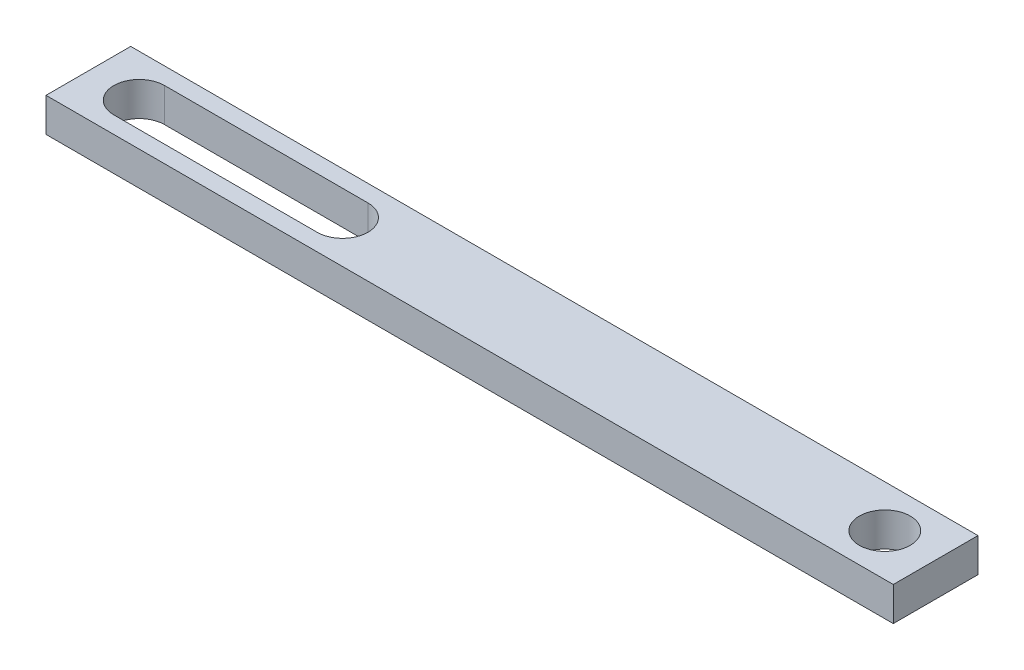
ISO-10303-21;
HEADER;
FILE_DESCRIPTION(('STEP AP214'),'2;1');
FILE_NAME('part.step','',(''),(''),'','','');
FILE_SCHEMA(('AUTOMOTIVE_DESIGN { 1 0 10303 214 1 1 1 1 }'));
ENDSEC;
DATA;
#1=APPLICATION_CONTEXT('core data for automotive mechanical design processes');
#2=APPLICATION_PROTOCOL_DEFINITION('international standard','automotive_design',2000,#1);
#3=PRODUCT_CONTEXT('',#1,'mechanical');
#4=PRODUCT('Part','Part','',(#3));
#5=PRODUCT_RELATED_PRODUCT_CATEGORY('part','',(#4));
#6=PRODUCT_DEFINITION_FORMATION('','',#4);
#7=PRODUCT_DEFINITION_CONTEXT('part definition',#1,'design');
#8=PRODUCT_DEFINITION('design','',#6,#7);
#9=PRODUCT_DEFINITION_SHAPE('','',#8);
#10=(LENGTH_UNIT() NAMED_UNIT(*) SI_UNIT(.MILLI.,.METRE.));
#11=(NAMED_UNIT(*) PLANE_ANGLE_UNIT() SI_UNIT($,.RADIAN.));
#12=(NAMED_UNIT(*) SI_UNIT($,.STERADIAN.) SOLID_ANGLE_UNIT());
#13=UNCERTAINTY_MEASURE_WITH_UNIT(LENGTH_MEASURE(1.E-05),#10,'distance_accuracy_value','');
#14=(GEOMETRIC_REPRESENTATION_CONTEXT(3) GLOBAL_UNCERTAINTY_ASSIGNED_CONTEXT((#13)) GLOBAL_UNIT_ASSIGNED_CONTEXT((#10,
#11,#12)) REPRESENTATION_CONTEXT('',''));
#15=CARTESIAN_POINT('',(0.,0.,0.));
#16=DIRECTION('',(0.,0.,1.));
#17=DIRECTION('',(1.,0.,0.));
#18=AXIS2_PLACEMENT_3D('',#15,#16,#17);
#19=CARTESIAN_POINT('',(0.,2.,0.));
#20=DIRECTION('',(0.,-1.,0.));
#21=DIRECTION('',(0.,0.,-1.));
#22=AXIS2_PLACEMENT_3D('',#19,#20,#21);
#23=PLANE('',#22);
#24=CARTESIAN_POINT('',(47.,2.,-2.5));
#25=DIRECTION('',(0.,1.,0.));
#26=DIRECTION('',(0.,0.,1.));
#27=AXIS2_PLACEMENT_3D('',#24,#25,#26);
#28=CIRCLE('',#27,1.5);
#29=CARTESIAN_POINT('',(47.,2.,-0.999999999999996));
#30=VERTEX_POINT('',#29);
#31=EDGE_CURVE('E141',#30,#30,#28,.T.);
#32=ORIENTED_EDGE('',*,*,#31,.F.);
#33=EDGE_LOOP('',(#32));
#34=FACE_BOUND('',#33,.T.);
#35=DIRECTION('',(0.,0.,1.));
#36=VECTOR('',#35,1.);
#37=CARTESIAN_POINT('',(0.,2.,0.));
#38=LINE('',#37,#36);
#39=CARTESIAN_POINT('',(0.,2.,-5.));
#40=VERTEX_POINT('',#39);
#41=CARTESIAN_POINT('',(0.,2.,0.));
#42=VERTEX_POINT('',#41);
#43=EDGE_CURVE('E147',#40,#42,#38,.T.);
#44=ORIENTED_EDGE('',*,*,#43,.T.);
#45=DIRECTION('',(1.,0.,0.));
#46=VECTOR('',#45,1.);
#47=CARTESIAN_POINT('',(0.,2.,0.));
#48=LINE('',#47,#46);
#49=CARTESIAN_POINT('',(50.,2.,0.));
#50=VERTEX_POINT('',#49);
#51=EDGE_CURVE('E150',#42,#50,#48,.T.);
#52=ORIENTED_EDGE('',*,*,#51,.T.);
#53=DIRECTION('',(0.,0.,-1.));
#54=VECTOR('',#53,1.);
#55=CARTESIAN_POINT('',(50.,2.,0.));
#56=LINE('',#55,#54);
#57=CARTESIAN_POINT('',(50.,2.,-5.));
#58=VERTEX_POINT('',#57);
#59=EDGE_CURVE('E153',#50,#58,#56,.T.);
#60=ORIENTED_EDGE('',*,*,#59,.T.);
#61=DIRECTION('',(-1.,0.,0.));
#62=VECTOR('',#61,1.);
#63=CARTESIAN_POINT('',(0.,2.,-5.));
#64=LINE('',#63,#62);
#65=EDGE_CURVE('E155',#58,#40,#64,.T.);
#66=ORIENTED_EDGE('',*,*,#65,.T.);
#67=EDGE_LOOP('',(#44,#52,#60,#66));
#68=FACE_BOUND('',#67,.T.);
#69=CARTESIAN_POINT('',(15.,2.,-2.5));
#70=DIRECTION('',(0.,1.,0.));
#71=DIRECTION('',(0.,0.,1.));
#72=AXIS2_PLACEMENT_3D('',#69,#70,#71);
#73=CIRCLE('',#72,1.5);
#74=CARTESIAN_POINT('',(15.,2.,-0.999999999999999));
#75=VERTEX_POINT('',#74);
#76=CARTESIAN_POINT('',(15.,2.,-4.));
#77=VERTEX_POINT('',#76);
#78=EDGE_CURVE('E105',#75,#77,#73,.T.);
#79=ORIENTED_EDGE('',*,*,#78,.F.);
#80=DIRECTION('',(1.,0.,0.));
#81=VECTOR('',#80,1.);
#82=CARTESIAN_POINT('',(15.,2.,-0.999999999999999));
#83=LINE('',#82,#81);
#84=CARTESIAN_POINT('',(3.,2.,-0.999999999999999));
#85=VERTEX_POINT('',#84);
#86=EDGE_CURVE('E127',#85,#75,#83,.T.);
#87=ORIENTED_EDGE('',*,*,#86,.F.);
#88=CARTESIAN_POINT('',(3.,2.,-2.5));
#89=DIRECTION('',(0.,1.,0.));
#90=DIRECTION('',(0.,0.,1.));
#91=AXIS2_PLACEMENT_3D('',#88,#89,#90);
#92=CIRCLE('',#91,1.5);
#93=CARTESIAN_POINT('',(3.,2.,-4.));
#94=VERTEX_POINT('',#93);
#95=EDGE_CURVE('E125',#94,#85,#92,.T.);
#96=ORIENTED_EDGE('',*,*,#95,.F.);
#97=DIRECTION('',(-1.,0.,0.));
#98=VECTOR('',#97,1.);
#99=CARTESIAN_POINT('',(3.,2.,-4.));
#100=LINE('',#99,#98);
#101=EDGE_CURVE('E113',#77,#94,#100,.T.);
#102=ORIENTED_EDGE('',*,*,#101,.F.);
#103=EDGE_LOOP('',(#79,#87,#96,#102));
#104=FACE_BOUND('',#103,.T.);
#105=ADVANCED_FACE('F40',(#34,#68,#104),#23,.F.);
#106=CARTESIAN_POINT('',(0.,0.,0.));
#107=DIRECTION('',(0.,-1.,0.));
#108=DIRECTION('',(0.,0.,-1.));
#109=AXIS2_PLACEMENT_3D('',#106,#107,#108);
#110=PLANE('',#109);
#111=DIRECTION('',(0.,0.,1.));
#112=VECTOR('',#111,1.);
#113=CARTESIAN_POINT('',(0.,0.,0.));
#114=LINE('',#113,#112);
#115=CARTESIAN_POINT('',(0.,0.,-5.));
#116=VERTEX_POINT('',#115);
#117=CARTESIAN_POINT('',(0.,0.,0.));
#118=VERTEX_POINT('',#117);
#119=EDGE_CURVE('E144',#116,#118,#114,.T.);
#120=ORIENTED_EDGE('',*,*,#119,.F.);
#121=DIRECTION('',(-1.,0.,0.));
#122=VECTOR('',#121,1.);
#123=CARTESIAN_POINT('',(0.,0.,-5.));
#124=LINE('',#123,#122);
#125=CARTESIAN_POINT('',(50.,0.,-5.));
#126=VERTEX_POINT('',#125);
#127=EDGE_CURVE('E151',#126,#116,#124,.T.);
#128=ORIENTED_EDGE('',*,*,#127,.F.);
#129=DIRECTION('',(0.,0.,-1.));
#130=VECTOR('',#129,1.);
#131=CARTESIAN_POINT('',(50.,0.,0.));
#132=LINE('',#131,#130);
#133=CARTESIAN_POINT('',(50.,0.,0.));
#134=VERTEX_POINT('',#133);
#135=EDGE_CURVE('E162',#134,#126,#132,.T.);
#136=ORIENTED_EDGE('',*,*,#135,.F.);
#137=DIRECTION('',(1.,0.,0.));
#138=VECTOR('',#137,1.);
#139=CARTESIAN_POINT('',(0.,0.,0.));
#140=LINE('',#139,#138);
#141=EDGE_CURVE('E160',#118,#134,#140,.T.);
#142=ORIENTED_EDGE('',*,*,#141,.F.);
#143=EDGE_LOOP('',(#120,#128,#136,#142));
#144=FACE_BOUND('',#143,.T.);
#145=CARTESIAN_POINT('',(47.,0.,-2.5));
#146=DIRECTION('',(0.,1.,0.));
#147=DIRECTION('',(0.,0.,1.));
#148=AXIS2_PLACEMENT_3D('',#145,#146,#147);
#149=CIRCLE('',#148,1.5);
#150=CARTESIAN_POINT('',(47.,0.,-0.999999999999996));
#151=VERTEX_POINT('',#150);
#152=EDGE_CURVE('E121',#151,#151,#149,.T.);
#153=ORIENTED_EDGE('',*,*,#152,.T.);
#154=EDGE_LOOP('',(#153));
#155=FACE_BOUND('',#154,.T.);
#156=DIRECTION('',(1.,0.,0.));
#157=VECTOR('',#156,1.);
#158=CARTESIAN_POINT('',(15.,0.,-0.999999999999999));
#159=LINE('',#158,#157);
#160=CARTESIAN_POINT('',(3.,0.,-0.999999999999999));
#161=VERTEX_POINT('',#160);
#162=CARTESIAN_POINT('',(15.,0.,-0.999999999999999));
#163=VERTEX_POINT('',#162);
#164=EDGE_CURVE('E114',#161,#163,#159,.T.);
#165=ORIENTED_EDGE('',*,*,#164,.T.);
#166=CARTESIAN_POINT('',(15.,0.,-2.5));
#167=DIRECTION('',(0.,1.,0.));
#168=DIRECTION('',(0.,0.,1.));
#169=AXIS2_PLACEMENT_3D('',#166,#167,#168);
#170=CIRCLE('',#169,1.5);
#171=CARTESIAN_POINT('',(15.,0.,-4.));
#172=VERTEX_POINT('',#171);
#173=EDGE_CURVE('E63',#163,#172,#170,.T.);
#174=ORIENTED_EDGE('',*,*,#173,.T.);
#175=DIRECTION('',(-1.,0.,0.));
#176=VECTOR('',#175,1.);
#177=CARTESIAN_POINT('',(3.,0.,-4.));
#178=LINE('',#177,#176);
#179=CARTESIAN_POINT('',(3.,0.,-4.));
#180=VERTEX_POINT('',#179);
#181=EDGE_CURVE('E120',#172,#180,#178,.T.);
#182=ORIENTED_EDGE('',*,*,#181,.T.);
#183=CARTESIAN_POINT('',(3.,0.,-2.5));
#184=DIRECTION('',(0.,1.,0.));
#185=DIRECTION('',(0.,0.,1.));
#186=AXIS2_PLACEMENT_3D('',#183,#184,#185);
#187=CIRCLE('',#186,1.5);
#188=EDGE_CURVE('E133',#180,#161,#187,.T.);
#189=ORIENTED_EDGE('',*,*,#188,.T.);
#190=EDGE_LOOP('',(#165,#174,#182,#189));
#191=FACE_BOUND('',#190,.T.);
#192=ADVANCED_FACE('F180',(#144,#155,#191),#110,.T.);
#193=CARTESIAN_POINT('',(0.,2.,0.));
#194=DIRECTION('',(1.,0.,0.));
#195=DIRECTION('',(0.,0.,-1.));
#196=AXIS2_PLACEMENT_3D('',#193,#194,#195);
#197=PLANE('',#196);
#198=ORIENTED_EDGE('',*,*,#119,.T.);
#199=DIRECTION('',(0.,-1.,0.));
#200=VECTOR('',#199,1.);
#201=CARTESIAN_POINT('',(0.,2.,0.));
#202=LINE('',#201,#200);
#203=EDGE_CURVE('E11',#42,#118,#202,.T.);
#204=ORIENTED_EDGE('',*,*,#203,.F.);
#205=ORIENTED_EDGE('',*,*,#43,.F.);
#206=DIRECTION('',(0.,-1.,0.));
#207=VECTOR('',#206,1.);
#208=CARTESIAN_POINT('',(0.,2.,-5.));
#209=LINE('',#208,#207);
#210=EDGE_CURVE('E157',#40,#116,#209,.T.);
#211=ORIENTED_EDGE('',*,*,#210,.T.);
#212=EDGE_LOOP('',(#198,#204,#205,#211));
#213=FACE_BOUND('',#212,.T.);
#214=ADVANCED_FACE('F42',(#213),#197,.F.);
#215=CARTESIAN_POINT('',(0.,2.,0.));
#216=DIRECTION('',(0.,0.,-1.));
#217=DIRECTION('',(-1.,0.,0.));
#218=AXIS2_PLACEMENT_3D('',#215,#216,#217);
#219=PLANE('',#218);
#220=ORIENTED_EDGE('',*,*,#141,.T.);
#221=DIRECTION('',(0.,-1.,0.));
#222=VECTOR('',#221,1.);
#223=CARTESIAN_POINT('',(50.,2.,0.));
#224=LINE('',#223,#222);
#225=EDGE_CURVE('E48',#50,#134,#224,.T.);
#226=ORIENTED_EDGE('',*,*,#225,.F.);
#227=ORIENTED_EDGE('',*,*,#51,.F.);
#228=ORIENTED_EDGE('',*,*,#203,.T.);
#229=EDGE_LOOP('',(#220,#226,#227,#228));
#230=FACE_BOUND('',#229,.T.);
#231=ADVANCED_FACE('F190',(#230),#219,.F.);
#232=CARTESIAN_POINT('',(50.,2.,0.));
#233=DIRECTION('',(-1.,0.,0.));
#234=DIRECTION('',(0.,0.,1.));
#235=AXIS2_PLACEMENT_3D('',#232,#233,#234);
#236=PLANE('',#235);
#237=ORIENTED_EDGE('',*,*,#135,.T.);
#238=DIRECTION('',(0.,-1.,0.));
#239=VECTOR('',#238,1.);
#240=CARTESIAN_POINT('',(50.,2.,-5.));
#241=LINE('',#240,#239);
#242=EDGE_CURVE('E167',#58,#126,#241,.T.);
#243=ORIENTED_EDGE('',*,*,#242,.F.);
#244=ORIENTED_EDGE('',*,*,#59,.F.);
#245=ORIENTED_EDGE('',*,*,#225,.T.);
#246=EDGE_LOOP('',(#237,#243,#244,#245));
#247=FACE_BOUND('',#246,.T.);
#248=ADVANCED_FACE('F174',(#247),#236,.F.);
#249=CARTESIAN_POINT('',(0.,2.,-5.));
#250=DIRECTION('',(0.,0.,1.));
#251=DIRECTION('',(1.,0.,0.));
#252=AXIS2_PLACEMENT_3D('',#249,#250,#251);
#253=PLANE('',#252);
#254=ORIENTED_EDGE('',*,*,#127,.T.);
#255=ORIENTED_EDGE('',*,*,#210,.F.);
#256=ORIENTED_EDGE('',*,*,#65,.F.);
#257=ORIENTED_EDGE('',*,*,#242,.T.);
#258=EDGE_LOOP('',(#254,#255,#256,#257));
#259=FACE_BOUND('',#258,.T.);
#260=ADVANCED_FACE('F184',(#259),#253,.F.);
#261=CARTESIAN_POINT('',(47.,2.,-2.5));
#262=DIRECTION('',(0.,-1.,0.));
#263=DIRECTION('',(0.,0.,-1.));
#264=AXIS2_PLACEMENT_3D('',#261,#262,#263);
#265=CYLINDRICAL_SURFACE('',#264,1.5);
#266=ORIENTED_EDGE('',*,*,#31,.T.);
#267=EDGE_LOOP('',(#266));
#268=FACE_BOUND('',#267,.T.);
#269=ORIENTED_EDGE('',*,*,#152,.F.);
#270=EDGE_LOOP('',(#269));
#271=FACE_BOUND('',#270,.T.);
#272=ADVANCED_FACE('F206',(#268,#271),#265,.F.);
#273=CARTESIAN_POINT('',(15.,2.,-2.5));
#274=DIRECTION('',(0.,-1.,0.));
#275=DIRECTION('',(0.,0.,-1.));
#276=AXIS2_PLACEMENT_3D('',#273,#274,#275);
#277=CYLINDRICAL_SURFACE('',#276,1.5);
#278=ORIENTED_EDGE('',*,*,#173,.F.);
#279=DIRECTION('',(0.,-1.,0.));
#280=VECTOR('',#279,1.);
#281=CARTESIAN_POINT('',(15.,2.,-0.999999999999999));
#282=LINE('',#281,#280);
#283=EDGE_CURVE('E109',#75,#163,#282,.T.);
#284=ORIENTED_EDGE('',*,*,#283,.F.);
#285=ORIENTED_EDGE('',*,*,#78,.T.);
#286=DIRECTION('',(0.,-1.,0.));
#287=VECTOR('',#286,1.);
#288=CARTESIAN_POINT('',(15.,2.,-4.));
#289=LINE('',#288,#287);
#290=EDGE_CURVE('E108',#77,#172,#289,.T.);
#291=ORIENTED_EDGE('',*,*,#290,.T.);
#292=EDGE_LOOP('',(#278,#284,#285,#291));
#293=FACE_BOUND('',#292,.T.);
#294=ADVANCED_FACE('F107',(#293),#277,.F.);
#295=CARTESIAN_POINT('',(3.,2.,-4.));
#296=DIRECTION('',(0.,0.,1.));
#297=DIRECTION('',(1.,0.,0.));
#298=AXIS2_PLACEMENT_3D('',#295,#296,#297);
#299=PLANE('',#298);
#300=ORIENTED_EDGE('',*,*,#181,.F.);
#301=ORIENTED_EDGE('',*,*,#290,.F.);
#302=ORIENTED_EDGE('',*,*,#101,.T.);
#303=DIRECTION('',(0.,-1.,0.));
#304=VECTOR('',#303,1.);
#305=CARTESIAN_POINT('',(3.,2.,-4.));
#306=LINE('',#305,#304);
#307=EDGE_CURVE('E122',#94,#180,#306,.T.);
#308=ORIENTED_EDGE('',*,*,#307,.T.);
#309=EDGE_LOOP('',(#300,#301,#302,#308));
#310=FACE_BOUND('',#309,.T.);
#311=ADVANCED_FACE('F117',(#310),#299,.T.);
#312=CARTESIAN_POINT('',(3.,2.,-2.5));
#313=DIRECTION('',(0.,-1.,0.));
#314=DIRECTION('',(0.,0.,-1.));
#315=AXIS2_PLACEMENT_3D('',#312,#313,#314);
#316=CYLINDRICAL_SURFACE('',#315,1.5);
#317=ORIENTED_EDGE('',*,*,#188,.F.);
#318=ORIENTED_EDGE('',*,*,#307,.F.);
#319=ORIENTED_EDGE('',*,*,#95,.T.);
#320=DIRECTION('',(0.,-1.,0.));
#321=VECTOR('',#320,1.);
#322=CARTESIAN_POINT('',(3.,2.,-0.999999999999999));
#323=LINE('',#322,#321);
#324=EDGE_CURVE('E55',#85,#161,#323,.T.);
#325=ORIENTED_EDGE('',*,*,#324,.T.);
#326=EDGE_LOOP('',(#317,#318,#319,#325));
#327=FACE_BOUND('',#326,.T.);
#328=ADVANCED_FACE('F223',(#327),#316,.F.);
#329=CARTESIAN_POINT('',(15.,2.,-0.999999999999999));
#330=DIRECTION('',(0.,0.,-1.));
#331=DIRECTION('',(-1.,0.,0.));
#332=AXIS2_PLACEMENT_3D('',#329,#330,#331);
#333=PLANE('',#332);
#334=ORIENTED_EDGE('',*,*,#164,.F.);
#335=ORIENTED_EDGE('',*,*,#324,.F.);
#336=ORIENTED_EDGE('',*,*,#86,.T.);
#337=ORIENTED_EDGE('',*,*,#283,.T.);
#338=EDGE_LOOP('',(#334,#335,#336,#337));
#339=FACE_BOUND('',#338,.T.);
#340=ADVANCED_FACE('F221',(#339),#333,.T.);
#341=CLOSED_SHELL('',(#105,#192,#214,#231,#248,#260,#272,#294,#311,#328,#340));
#342=MANIFOLD_SOLID_BREP('B2',#341);
#343=ADVANCED_BREP_SHAPE_REPRESENTATION('',(#18,#342),#14);
#344=SHAPE_DEFINITION_REPRESENTATION(#9,#343);
ENDSEC;
END-ISO-10303-21;
